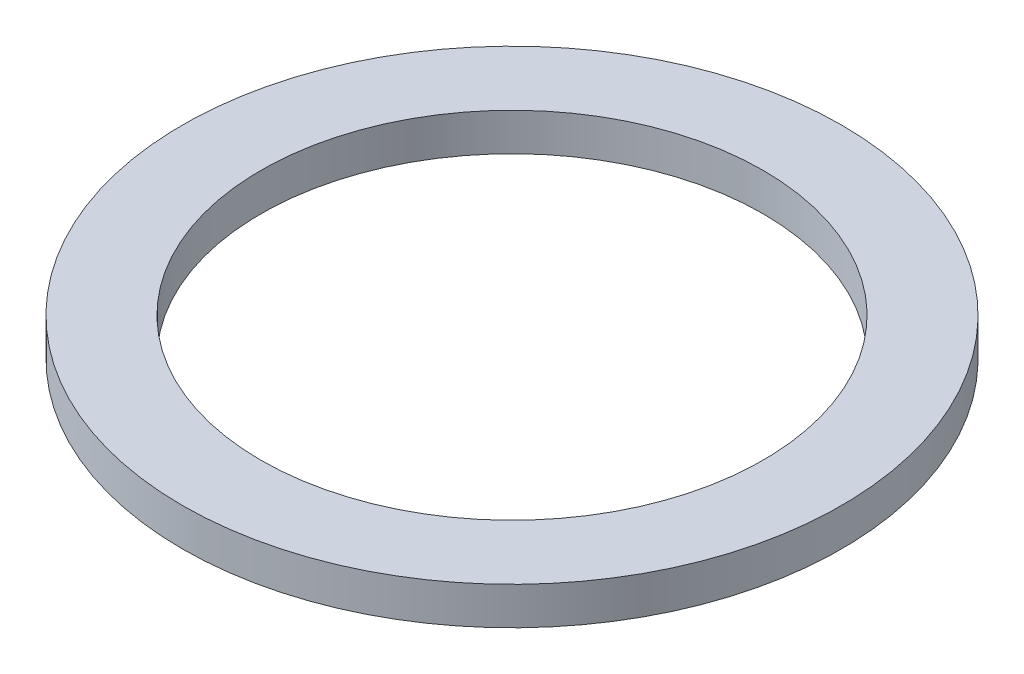
ISO-10303-21;
HEADER;
FILE_DESCRIPTION(('STEP AP214'),'2;1');
FILE_NAME('part.step','',(''),(''),'','','');
FILE_SCHEMA(('AUTOMOTIVE_DESIGN { 1 0 10303 214 1 1 1 1 }'));
ENDSEC;
DATA;
#1=APPLICATION_CONTEXT('core data for automotive mechanical design processes');
#2=APPLICATION_PROTOCOL_DEFINITION('international standard','automotive_design',2000,#1);
#3=PRODUCT_CONTEXT('',#1,'mechanical');
#4=PRODUCT('Part','Part','',(#3));
#5=PRODUCT_RELATED_PRODUCT_CATEGORY('part','',(#4));
#6=PRODUCT_DEFINITION_FORMATION('','',#4);
#7=PRODUCT_DEFINITION_CONTEXT('part definition',#1,'design');
#8=PRODUCT_DEFINITION('design','',#6,#7);
#9=PRODUCT_DEFINITION_SHAPE('','',#8);
#10=(LENGTH_UNIT() NAMED_UNIT(*) SI_UNIT(.MILLI.,.METRE.));
#11=(NAMED_UNIT(*) PLANE_ANGLE_UNIT() SI_UNIT($,.RADIAN.));
#12=(NAMED_UNIT(*) SI_UNIT($,.STERADIAN.) SOLID_ANGLE_UNIT());
#13=UNCERTAINTY_MEASURE_WITH_UNIT(LENGTH_MEASURE(1.E-05),#10,'distance_accuracy_value','');
#14=(GEOMETRIC_REPRESENTATION_CONTEXT(3) GLOBAL_UNCERTAINTY_ASSIGNED_CONTEXT((#13)) GLOBAL_UNIT_ASSIGNED_CONTEXT((#10,
#11,#12)) REPRESENTATION_CONTEXT('',''));
#15=CARTESIAN_POINT('',(0.,0.,0.));
#16=DIRECTION('',(0.,0.,1.));
#17=DIRECTION('',(1.,0.,0.));
#18=AXIS2_PLACEMENT_3D('',#15,#16,#17);
#19=CARTESIAN_POINT('',(0.,6.,0.));
#20=DIRECTION('',(0.,1.,0.));
#21=DIRECTION('',(0.,0.,1.));
#22=AXIS2_PLACEMENT_3D('',#19,#20,#21);
#23=PLANE('',#22);
#24=CARTESIAN_POINT('',(0.,6.,0.));
#25=DIRECTION('',(0.,1.,0.));
#26=DIRECTION('',(0.,0.,1.));
#27=AXIS2_PLACEMENT_3D('',#24,#25,#26);
#28=CIRCLE('',#27,52.5);
#29=CARTESIAN_POINT('',(0.,6.,52.5));
#30=VERTEX_POINT('',#29);
#31=EDGE_CURVE('E10',#30,#30,#28,.T.);
#32=ORIENTED_EDGE('',*,*,#31,.T.);
#33=EDGE_LOOP('',(#32));
#34=FACE_BOUND('',#33,.T.);
#35=CARTESIAN_POINT('',(0.,6.,0.));
#36=DIRECTION('',(0.,1.,0.));
#37=DIRECTION('',(0.,0.,1.));
#38=AXIS2_PLACEMENT_3D('',#35,#36,#37);
#39=CIRCLE('',#38,40.);
#40=CARTESIAN_POINT('',(0.,6.,40.));
#41=VERTEX_POINT('',#40);
#42=EDGE_CURVE('E54',#41,#41,#39,.T.);
#43=ORIENTED_EDGE('',*,*,#42,.F.);
#44=EDGE_LOOP('',(#43));
#45=FACE_BOUND('',#44,.T.);
#46=ADVANCED_FACE('F41',(#34,#45),#23,.T.);
#47=CARTESIAN_POINT('',(0.,0.,0.));
#48=DIRECTION('',(0.,1.,0.));
#49=DIRECTION('',(0.,0.,1.));
#50=AXIS2_PLACEMENT_3D('',#47,#48,#49);
#51=PLANE('',#50);
#52=CARTESIAN_POINT('',(0.,0.,0.));
#53=DIRECTION('',(0.,1.,0.));
#54=DIRECTION('',(0.,0.,1.));
#55=AXIS2_PLACEMENT_3D('',#52,#53,#54);
#56=CIRCLE('',#55,52.5);
#57=CARTESIAN_POINT('',(0.,0.,52.5));
#58=VERTEX_POINT('',#57);
#59=EDGE_CURVE('E45',#58,#58,#56,.T.);
#60=ORIENTED_EDGE('',*,*,#59,.F.);
#61=EDGE_LOOP('',(#60));
#62=FACE_BOUND('',#61,.T.);
#63=CARTESIAN_POINT('',(0.,0.,0.));
#64=DIRECTION('',(0.,1.,0.));
#65=DIRECTION('',(0.,0.,1.));
#66=AXIS2_PLACEMENT_3D('',#63,#64,#65);
#67=CIRCLE('',#66,40.);
#68=CARTESIAN_POINT('',(0.,0.,40.));
#69=VERTEX_POINT('',#68);
#70=EDGE_CURVE('E56',#69,#69,#67,.T.);
#71=ORIENTED_EDGE('',*,*,#70,.T.);
#72=EDGE_LOOP('',(#71));
#73=FACE_BOUND('',#72,.T.);
#74=ADVANCED_FACE('F68',(#62,#73),#51,.F.);
#75=CARTESIAN_POINT('',(0.,6.,0.));
#76=DIRECTION('',(0.,-1.,0.));
#77=DIRECTION('',(0.,0.,-1.));
#78=AXIS2_PLACEMENT_3D('',#75,#76,#77);
#79=CYLINDRICAL_SURFACE('',#78,52.5);
#80=ORIENTED_EDGE('',*,*,#31,.F.);
#81=EDGE_LOOP('',(#80));
#82=FACE_BOUND('',#81,.T.);
#83=ORIENTED_EDGE('',*,*,#59,.T.);
#84=EDGE_LOOP('',(#83));
#85=FACE_BOUND('',#84,.T.);
#86=ADVANCED_FACE('F43',(#82,#85),#79,.T.);
#87=CARTESIAN_POINT('',(0.,6.,0.));
#88=DIRECTION('',(0.,-1.,0.));
#89=DIRECTION('',(0.,0.,-1.));
#90=AXIS2_PLACEMENT_3D('',#87,#88,#89);
#91=CYLINDRICAL_SURFACE('',#90,40.);
#92=ORIENTED_EDGE('',*,*,#42,.T.);
#93=EDGE_LOOP('',(#92));
#94=FACE_BOUND('',#93,.T.);
#95=ORIENTED_EDGE('',*,*,#70,.F.);
#96=EDGE_LOOP('',(#95));
#97=FACE_BOUND('',#96,.T.);
#98=ADVANCED_FACE('F64',(#94,#97),#91,.F.);
#99=CLOSED_SHELL('',(#46,#74,#86,#98));
#100=MANIFOLD_SOLID_BREP('B2',#99);
#101=ADVANCED_BREP_SHAPE_REPRESENTATION('',(#18,#100),#14);
#102=SHAPE_DEFINITION_REPRESENTATION(#9,#101);
ENDSEC;
END-ISO-10303-21;
